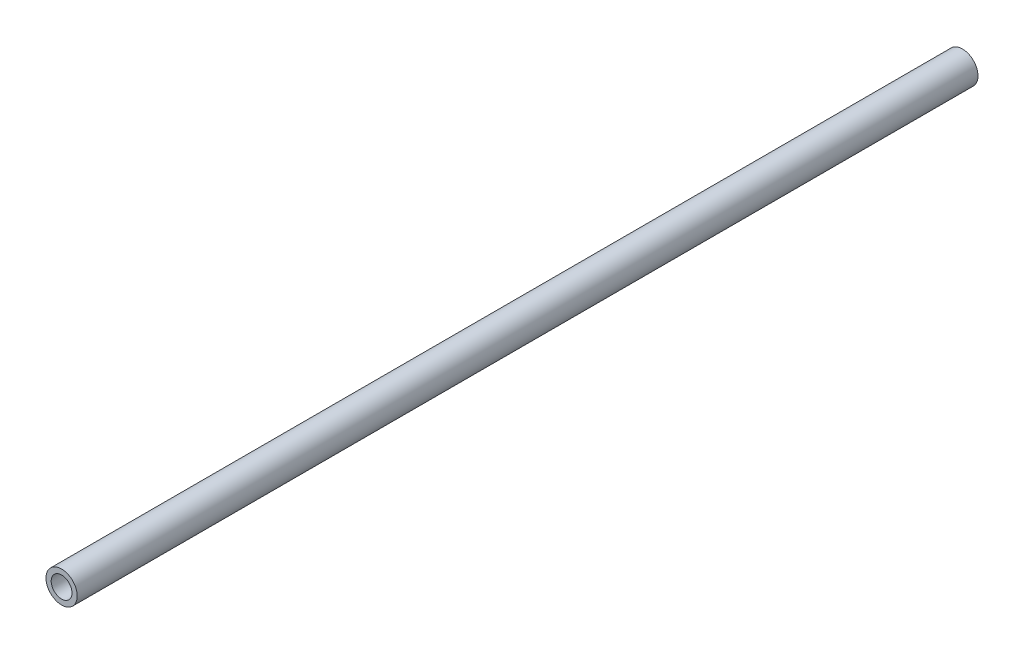
ISO-10303-21;
HEADER;
FILE_DESCRIPTION(('STEP AP214'),'2;1');
FILE_NAME('part.step','',(''),(''),'','','');
FILE_SCHEMA(('AUTOMOTIVE_DESIGN { 1 0 10303 214 1 1 1 1 }'));
ENDSEC;
DATA;
#1=APPLICATION_CONTEXT('core data for automotive mechanical design processes');
#2=APPLICATION_PROTOCOL_DEFINITION('international standard','automotive_design',2000,#1);
#3=PRODUCT_CONTEXT('',#1,'mechanical');
#4=PRODUCT('Part','Part','',(#3));
#5=PRODUCT_RELATED_PRODUCT_CATEGORY('part','',(#4));
#6=PRODUCT_DEFINITION_FORMATION('','',#4);
#7=PRODUCT_DEFINITION_CONTEXT('part definition',#1,'design');
#8=PRODUCT_DEFINITION('design','',#6,#7);
#9=PRODUCT_DEFINITION_SHAPE('','',#8);
#10=(LENGTH_UNIT() NAMED_UNIT(*) SI_UNIT(.MILLI.,.METRE.));
#11=(NAMED_UNIT(*) PLANE_ANGLE_UNIT() SI_UNIT($,.RADIAN.));
#12=(NAMED_UNIT(*) SI_UNIT($,.STERADIAN.) SOLID_ANGLE_UNIT());
#13=UNCERTAINTY_MEASURE_WITH_UNIT(LENGTH_MEASURE(1.E-05),#10,'distance_accuracy_value','');
#14=(GEOMETRIC_REPRESENTATION_CONTEXT(3) GLOBAL_UNCERTAINTY_ASSIGNED_CONTEXT((#13)) GLOBAL_UNIT_ASSIGNED_CONTEXT((#10,
#11,#12)) REPRESENTATION_CONTEXT('',''));
#15=CARTESIAN_POINT('',(0.,0.,0.));
#16=DIRECTION('',(0.,0.,1.));
#17=DIRECTION('',(1.,0.,0.));
#18=AXIS2_PLACEMENT_3D('',#15,#16,#17);
#19=CARTESIAN_POINT('',(0.,0.,173.));
#20=DIRECTION('',(0.,0.,1.));
#21=DIRECTION('',(1.,0.,0.));
#22=AXIS2_PLACEMENT_3D('',#19,#20,#21);
#23=PLANE('',#22);
#24=CARTESIAN_POINT('',(0.,0.,173.));
#25=DIRECTION('',(0.,0.,1.));
#26=DIRECTION('',(1.,0.,0.));
#27=AXIS2_PLACEMENT_3D('',#24,#25,#26);
#28=CIRCLE('',#27,3.);
#29=CARTESIAN_POINT('',(3.,0.,173.));
#30=VERTEX_POINT('',#29);
#31=EDGE_CURVE('E10',#30,#30,#28,.T.);
#32=ORIENTED_EDGE('',*,*,#31,.T.);
#33=EDGE_LOOP('',(#32));
#34=FACE_BOUND('',#33,.T.);
#35=CARTESIAN_POINT('',(0.,0.,173.));
#36=DIRECTION('',(0.,0.,1.));
#37=DIRECTION('',(1.,0.,0.));
#38=AXIS2_PLACEMENT_3D('',#35,#36,#37);
#39=CIRCLE('',#38,2.);
#40=CARTESIAN_POINT('',(2.,0.,173.));
#41=VERTEX_POINT('',#40);
#42=EDGE_CURVE('E41',#41,#41,#39,.T.);
#43=ORIENTED_EDGE('',*,*,#42,.F.);
#44=EDGE_LOOP('',(#43));
#45=FACE_BOUND('',#44,.T.);
#46=ADVANCED_FACE('F30',(#34,#45),#23,.T.);
#47=CARTESIAN_POINT('',(0.,0.,0.));
#48=DIRECTION('',(0.,0.,1.));
#49=DIRECTION('',(1.,0.,0.));
#50=AXIS2_PLACEMENT_3D('',#47,#48,#49);
#51=PLANE('',#50);
#52=CARTESIAN_POINT('',(0.,0.,0.));
#53=DIRECTION('',(0.,0.,1.));
#54=DIRECTION('',(1.,0.,0.));
#55=AXIS2_PLACEMENT_3D('',#52,#53,#54);
#56=CIRCLE('',#55,3.);
#57=CARTESIAN_POINT('',(3.,0.,0.));
#58=VERTEX_POINT('',#57);
#59=EDGE_CURVE('E34',#58,#58,#56,.T.);
#60=ORIENTED_EDGE('',*,*,#59,.F.);
#61=EDGE_LOOP('',(#60));
#62=FACE_BOUND('',#61,.T.);
#63=CARTESIAN_POINT('',(0.,0.,0.));
#64=DIRECTION('',(0.,0.,1.));
#65=DIRECTION('',(1.,0.,0.));
#66=AXIS2_PLACEMENT_3D('',#63,#64,#65);
#67=CIRCLE('',#66,2.);
#68=CARTESIAN_POINT('',(2.,0.,0.));
#69=VERTEX_POINT('',#68);
#70=EDGE_CURVE('E43',#69,#69,#67,.T.);
#71=ORIENTED_EDGE('',*,*,#70,.T.);
#72=EDGE_LOOP('',(#71));
#73=FACE_BOUND('',#72,.T.);
#74=ADVANCED_FACE('F53',(#62,#73),#51,.F.);
#75=CARTESIAN_POINT('',(0.,0.,173.));
#76=DIRECTION('',(0.,0.,-1.));
#77=DIRECTION('',(-1.,0.,0.));
#78=AXIS2_PLACEMENT_3D('',#75,#76,#77);
#79=CYLINDRICAL_SURFACE('',#78,3.);
#80=ORIENTED_EDGE('',*,*,#31,.F.);
#81=EDGE_LOOP('',(#80));
#82=FACE_BOUND('',#81,.T.);
#83=ORIENTED_EDGE('',*,*,#59,.T.);
#84=EDGE_LOOP('',(#83));
#85=FACE_BOUND('',#84,.T.);
#86=ADVANCED_FACE('F32',(#82,#85),#79,.T.);
#87=CARTESIAN_POINT('',(0.,0.,173.));
#88=DIRECTION('',(0.,0.,-1.));
#89=DIRECTION('',(-1.,0.,0.));
#90=AXIS2_PLACEMENT_3D('',#87,#88,#89);
#91=CYLINDRICAL_SURFACE('',#90,2.);
#92=ORIENTED_EDGE('',*,*,#42,.T.);
#93=EDGE_LOOP('',(#92));
#94=FACE_BOUND('',#93,.T.);
#95=ORIENTED_EDGE('',*,*,#70,.F.);
#96=EDGE_LOOP('',(#95));
#97=FACE_BOUND('',#96,.T.);
#98=ADVANCED_FACE('F49',(#94,#97),#91,.F.);
#99=CLOSED_SHELL('',(#46,#74,#86,#98));
#100=MANIFOLD_SOLID_BREP('B2',#99);
#101=ADVANCED_BREP_SHAPE_REPRESENTATION('',(#18,#100),#14);
#102=SHAPE_DEFINITION_REPRESENTATION(#9,#101);
ENDSEC;
END-ISO-10303-21;
